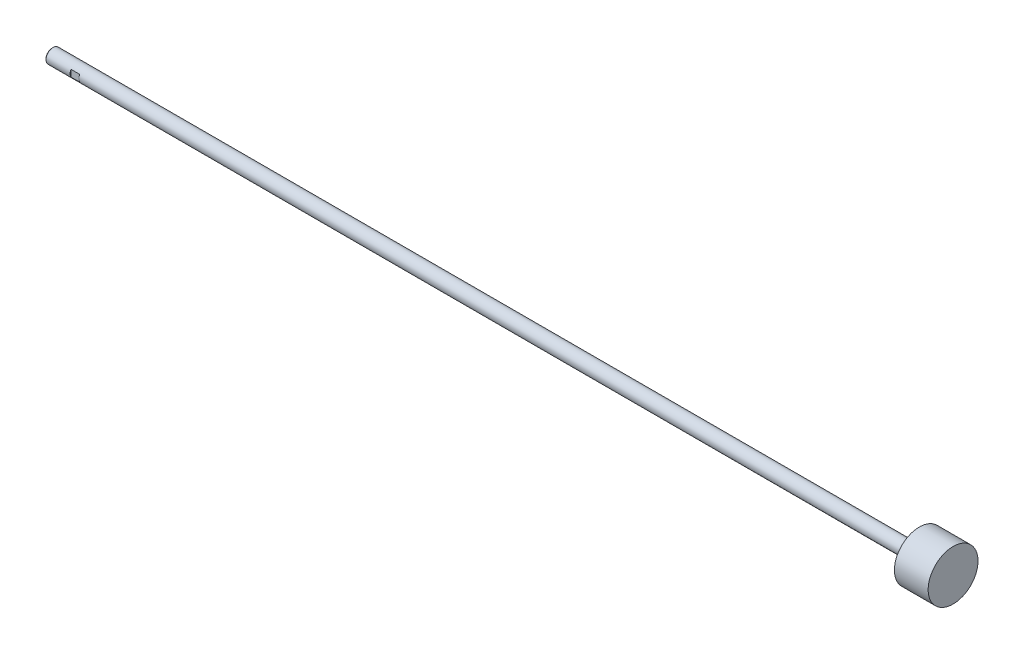
ISO-10303-21;
HEADER;
FILE_DESCRIPTION(('STEP AP214'),'2;1');
FILE_NAME('part.step','',(''),(''),'','','');
FILE_SCHEMA(('AUTOMOTIVE_DESIGN { 1 0 10303 214 1 1 1 1 }'));
ENDSEC;
DATA;
#1=APPLICATION_CONTEXT('core data for automotive mechanical design processes');
#2=APPLICATION_PROTOCOL_DEFINITION('international standard','automotive_design',2000,#1);
#3=PRODUCT_CONTEXT('',#1,'mechanical');
#4=PRODUCT('Part','Part','',(#3));
#5=PRODUCT_RELATED_PRODUCT_CATEGORY('part','',(#4));
#6=PRODUCT_DEFINITION_FORMATION('','',#4);
#7=PRODUCT_DEFINITION_CONTEXT('part definition',#1,'design');
#8=PRODUCT_DEFINITION('design','',#6,#7);
#9=PRODUCT_DEFINITION_SHAPE('','',#8);
#10=(LENGTH_UNIT() NAMED_UNIT(*) SI_UNIT(.MILLI.,.METRE.));
#11=(NAMED_UNIT(*) PLANE_ANGLE_UNIT() SI_UNIT($,.RADIAN.));
#12=(NAMED_UNIT(*) SI_UNIT($,.STERADIAN.) SOLID_ANGLE_UNIT());
#13=UNCERTAINTY_MEASURE_WITH_UNIT(LENGTH_MEASURE(1.E-05),#10,'distance_accuracy_value','');
#14=(GEOMETRIC_REPRESENTATION_CONTEXT(3) GLOBAL_UNCERTAINTY_ASSIGNED_CONTEXT((#13)) GLOBAL_UNIT_ASSIGNED_CONTEXT((#10,
#11,#12)) REPRESENTATION_CONTEXT('',''));
#15=CARTESIAN_POINT('',(0.,0.,0.));
#16=DIRECTION('',(0.,0.,1.));
#17=DIRECTION('',(1.,0.,0.));
#18=AXIS2_PLACEMENT_3D('',#15,#16,#17);
#19=CARTESIAN_POINT('',(403.2885,22.34565,0.));
#20=DIRECTION('',(-1.,0.,0.));
#21=DIRECTION('',(0.,0.,1.));
#22=AXIS2_PLACEMENT_3D('',#19,#20,#21);
#23=PLANE('',#22);
#24=CARTESIAN_POINT('',(403.2885,0.,0.));
#25=DIRECTION('',(-1.,0.,0.));
#26=DIRECTION('',(0.,0.,1.));
#27=AXIS2_PLACEMENT_3D('',#24,#25,#26);
#28=CIRCLE('',#27,22.34565);
#29=CARTESIAN_POINT('',(403.2885,0.,22.34565));
#30=VERTEX_POINT('',#29);
#31=EDGE_CURVE('E19',#30,#30,#28,.T.);
#32=ORIENTED_EDGE('',*,*,#31,.F.);
#33=EDGE_LOOP('',(#32));
#34=FACE_BOUND('',#33,.T.);
#35=ADVANCED_FACE('F16',(#34),#23,.F.);
#36=CARTESIAN_POINT('',(403.2885,0.,0.));
#37=DIRECTION('',(-1.,0.,0.));
#38=DIRECTION('',(0.,0.,1.));
#39=AXIS2_PLACEMENT_3D('',#36,#37,#38);
#40=CYLINDRICAL_SURFACE('',#39,22.34565);
#41=CARTESIAN_POINT('',(373.0625,0.,0.));
#42=DIRECTION('',(-1.,0.,0.));
#43=DIRECTION('',(0.,0.,1.));
#44=AXIS2_PLACEMENT_3D('',#41,#42,#43);
#45=CIRCLE('',#44,22.34565);
#46=CARTESIAN_POINT('',(373.0625,0.,22.34565));
#47=VERTEX_POINT('',#46);
#48=EDGE_CURVE('E93',#47,#47,#45,.F.);
#49=ORIENTED_EDGE('',*,*,#48,.T.);
#50=EDGE_LOOP('',(#49));
#51=FACE_BOUND('',#50,.T.);
#52=ORIENTED_EDGE('',*,*,#31,.T.);
#53=EDGE_LOOP('',(#52));
#54=FACE_BOUND('',#53,.T.);
#55=ADVANCED_FACE('F100',(#51,#54),#40,.T.);
#56=CARTESIAN_POINT('',(-403.2885,0.,0.));
#57=DIRECTION('',(1.,0.,0.));
#58=DIRECTION('',(0.,0.,-1.));
#59=AXIS2_PLACEMENT_3D('',#56,#57,#58);
#60=PLANE('',#59);
#61=CARTESIAN_POINT('',(-403.288500000031,0.,0.));
#62=DIRECTION('',(1.,0.,0.));
#63=DIRECTION('',(0.,0.,-1.));
#64=AXIS2_PLACEMENT_3D('',#61,#62,#63);
#65=CIRCLE('',#64,5.59435000008079);
#66=CARTESIAN_POINT('',(-403.288500000031,0.,-5.59435000008079));
#67=VERTEX_POINT('',#66);
#68=EDGE_CURVE('E74',#67,#67,#65,.T.);
#69=ORIENTED_EDGE('',*,*,#68,.F.);
#70=EDGE_LOOP('',(#69));
#71=FACE_BOUND('',#70,.T.);
#72=ADVANCED_FACE('F107',(#71),#60,.F.);
#73=CARTESIAN_POINT('',(373.0625,6.35,0.));
#74=DIRECTION('',(1.,0.,0.));
#75=DIRECTION('',(0.,0.,-1.));
#76=AXIS2_PLACEMENT_3D('',#73,#74,#75);
#77=PLANE('',#76);
#78=CARTESIAN_POINT('',(373.0625,0.,0.));
#79=DIRECTION('',(-1.,0.,0.));
#80=DIRECTION('',(0.,0.,1.));
#81=AXIS2_PLACEMENT_3D('',#78,#79,#80);
#82=CIRCLE('',#81,6.35);
#83=CARTESIAN_POINT('',(373.0625,0.,6.35));
#84=VERTEX_POINT('',#83);
#85=EDGE_CURVE('E91',#84,#84,#82,.T.);
#86=ORIENTED_EDGE('',*,*,#85,.F.);
#87=EDGE_LOOP('',(#86));
#88=FACE_BOUND('',#87,.T.);
#89=ORIENTED_EDGE('',*,*,#48,.F.);
#90=EDGE_LOOP('',(#89));
#91=FACE_BOUND('',#90,.T.);
#92=ADVANCED_FACE('F136',(#88,#91),#77,.F.);
#93=CARTESIAN_POINT('',(-373.0625,0.,0.));
#94=DIRECTION('',(1.,0.,0.));
#95=DIRECTION('',(0.,0.,-1.));
#96=AXIS2_PLACEMENT_3D('',#93,#94,#95);
#97=PLANE('',#96);
#98=CARTESIAN_POINT('',(-373.0625,0.,0.));
#99=DIRECTION('',(-1.,0.,0.));
#100=DIRECTION('',(0.,0.,1.));
#101=AXIS2_PLACEMENT_3D('',#98,#99,#100);
#102=CIRCLE('',#101,6.35);
#103=CARTESIAN_POINT('',(-373.0625,3.01608289010763,5.588));
#104=VERTEX_POINT('',#103);
#105=CARTESIAN_POINT('',(-373.0625,-3.01608289010763,5.588));
#106=VERTEX_POINT('',#105);
#107=EDGE_CURVE('E53',#104,#106,#102,.F.);
#108=ORIENTED_EDGE('',*,*,#107,.F.);
#109=DIRECTION('',(0.,1.,0.));
#110=VECTOR('',#109,1.);
#111=CARTESIAN_POINT('',(-373.0625,6.35,5.588));
#112=LINE('',#111,#110);
#113=EDGE_CURVE('E75',#104,#106,#112,.F.);
#114=ORIENTED_EDGE('',*,*,#113,.T.);
#115=EDGE_LOOP('',(#108,#114));
#116=FACE_BOUND('',#115,.T.);
#117=ADVANCED_FACE('F133',(#116),#97,.F.);
#118=CARTESIAN_POINT('',(-373.0625,6.35,5.588));
#119=DIRECTION('',(0.,0.,-1.));
#120=DIRECTION('',(-1.,0.,0.));
#121=AXIS2_PLACEMENT_3D('',#118,#119,#120);
#122=PLANE('',#121);
#123=DIRECTION('',(-1.,0.,0.));
#124=VECTOR('',#123,1.);
#125=CARTESIAN_POINT('',(403.2885,-3.01608289010763,5.588));
#126=LINE('',#125,#124);
#127=CARTESIAN_POINT('',(-380.9365,-3.01608289010763,5.588));
#128=VERTEX_POINT('',#127);
#129=EDGE_CURVE('E67',#106,#128,#126,.T.);
#130=ORIENTED_EDGE('',*,*,#129,.F.);
#131=ORIENTED_EDGE('',*,*,#113,.F.);
#132=DIRECTION('',(-1.,0.,0.));
#133=VECTOR('',#132,1.);
#134=CARTESIAN_POINT('',(403.2885,3.01608289010763,5.588));
#135=LINE('',#134,#133);
#136=CARTESIAN_POINT('',(-380.9365,3.01608289010763,5.588));
#137=VERTEX_POINT('',#136);
#138=EDGE_CURVE('E65',#137,#104,#135,.F.);
#139=ORIENTED_EDGE('',*,*,#138,.F.);
#140=DIRECTION('',(0.,1.,0.));
#141=VECTOR('',#140,1.);
#142=CARTESIAN_POINT('',(-380.9365,0.,5.588));
#143=LINE('',#142,#141);
#144=EDGE_CURVE('E71',#128,#137,#143,.T.);
#145=ORIENTED_EDGE('',*,*,#144,.F.);
#146=EDGE_LOOP('',(#130,#131,#139,#145));
#147=FACE_BOUND('',#146,.T.);
#148=ADVANCED_FACE('F77',(#147),#122,.F.);
#149=CARTESIAN_POINT('',(-380.9365,0.,0.));
#150=DIRECTION('',(1.,0.,0.));
#151=DIRECTION('',(0.,0.,-1.));
#152=AXIS2_PLACEMENT_3D('',#149,#150,#151);
#153=PLANE('',#152);
#154=CARTESIAN_POINT('',(-380.9365,0.,0.));
#155=DIRECTION('',(-1.,0.,0.));
#156=DIRECTION('',(0.,0.,1.));
#157=AXIS2_PLACEMENT_3D('',#154,#155,#156);
#158=CIRCLE('',#157,6.35);
#159=EDGE_CURVE('E60',#128,#137,#158,.T.);
#160=ORIENTED_EDGE('',*,*,#159,.F.);
#161=ORIENTED_EDGE('',*,*,#144,.T.);
#162=EDGE_LOOP('',(#160,#161));
#163=FACE_BOUND('',#162,.T.);
#164=ADVANCED_FACE('F72',(#163),#153,.T.);
#165=CARTESIAN_POINT('',(-402.532850000057,0.,0.));
#166=DIRECTION('',(1.,0.,0.));
#167=DIRECTION('',(0.,0.,-1.));
#168=AXIS2_PLACEMENT_3D('',#165,#166,#167);
#169=CONICAL_SURFACE('',#168,6.35000000005448,0.785398163397448);
#170=CARTESIAN_POINT('',(-402.53285,0.,0.));
#171=DIRECTION('',(-1.,0.,0.));
#172=DIRECTION('',(0.,0.,1.));
#173=AXIS2_PLACEMENT_3D('',#170,#171,#172);
#174=CIRCLE('',#173,6.35);
#175=CARTESIAN_POINT('',(-402.53285,0.,6.35));
#176=VERTEX_POINT('',#175);
#177=EDGE_CURVE('E69',#176,#176,#174,.F.);
#178=ORIENTED_EDGE('',*,*,#177,.F.);
#179=EDGE_LOOP('',(#178));
#180=FACE_BOUND('',#179,.T.);
#181=ORIENTED_EDGE('',*,*,#68,.T.);
#182=EDGE_LOOP('',(#181));
#183=FACE_BOUND('',#182,.T.);
#184=ADVANCED_FACE('F124',(#180,#183),#169,.T.);
#185=CARTESIAN_POINT('',(-380.9365,0.,0.));
#186=DIRECTION('',(1.,0.,0.));
#187=DIRECTION('',(0.,0.,-1.));
#188=AXIS2_PLACEMENT_3D('',#185,#186,#187);
#189=PLANE('',#188);
#190=CARTESIAN_POINT('',(-380.9365,0.,0.));
#191=DIRECTION('',(-1.,0.,0.));
#192=DIRECTION('',(0.,0.,1.));
#193=AXIS2_PLACEMENT_3D('',#190,#191,#192);
#194=CIRCLE('',#193,6.35);
#195=CARTESIAN_POINT('',(-380.9365,3.01608289010763,-5.588));
#196=VERTEX_POINT('',#195);
#197=CARTESIAN_POINT('',(-380.9365,-3.01608289010763,-5.588));
#198=VERTEX_POINT('',#197);
#199=EDGE_CURVE('E87',#196,#198,#194,.T.);
#200=ORIENTED_EDGE('',*,*,#199,.F.);
#201=DIRECTION('',(0.,1.,0.));
#202=VECTOR('',#201,1.);
#203=CARTESIAN_POINT('',(-380.9365,-6.35,-5.588));
#204=LINE('',#203,#202);
#205=EDGE_CURVE('E81',#196,#198,#204,.F.);
#206=ORIENTED_EDGE('',*,*,#205,.T.);
#207=EDGE_LOOP('',(#200,#206));
#208=FACE_BOUND('',#207,.T.);
#209=ADVANCED_FACE('F121',(#208),#189,.T.);
#210=CARTESIAN_POINT('',(-373.0625,-6.35,-5.588));
#211=DIRECTION('',(0.,0.,1.));
#212=DIRECTION('',(1.,0.,0.));
#213=AXIS2_PLACEMENT_3D('',#210,#211,#212);
#214=PLANE('',#213);
#215=DIRECTION('',(1.,0.,0.));
#216=VECTOR('',#215,1.);
#217=CARTESIAN_POINT('',(-373.0625,3.01608289010763,-5.588));
#218=LINE('',#217,#216);
#219=CARTESIAN_POINT('',(-373.0625,3.01608289010763,-5.588));
#220=VERTEX_POINT('',#219);
#221=EDGE_CURVE('E78',#220,#196,#218,.F.);
#222=ORIENTED_EDGE('',*,*,#221,.F.);
#223=DIRECTION('',(0.,1.,0.));
#224=VECTOR('',#223,1.);
#225=CARTESIAN_POINT('',(-373.0625,0.,-5.588));
#226=LINE('',#225,#224);
#227=CARTESIAN_POINT('',(-373.0625,-3.01608289010763,-5.588));
#228=VERTEX_POINT('',#227);
#229=EDGE_CURVE('E34',#220,#228,#226,.F.);
#230=ORIENTED_EDGE('',*,*,#229,.T.);
#231=DIRECTION('',(-1.,0.,0.));
#232=VECTOR('',#231,1.);
#233=CARTESIAN_POINT('',(403.2885,-3.01608289010763,-5.588));
#234=LINE('',#233,#232);
#235=EDGE_CURVE('E25',#198,#228,#234,.F.);
#236=ORIENTED_EDGE('',*,*,#235,.F.);
#237=ORIENTED_EDGE('',*,*,#205,.F.);
#238=EDGE_LOOP('',(#222,#230,#236,#237));
#239=FACE_BOUND('',#238,.T.);
#240=ADVANCED_FACE('F115',(#239),#214,.F.);
#241=CARTESIAN_POINT('',(-373.0625,0.,0.));
#242=DIRECTION('',(1.,0.,0.));
#243=DIRECTION('',(0.,0.,-1.));
#244=AXIS2_PLACEMENT_3D('',#241,#242,#243);
#245=PLANE('',#244);
#246=ORIENTED_EDGE('',*,*,#229,.F.);
#247=CARTESIAN_POINT('',(-373.0625,0.,0.));
#248=DIRECTION('',(-1.,0.,0.));
#249=DIRECTION('',(0.,0.,1.));
#250=AXIS2_PLACEMENT_3D('',#247,#248,#249);
#251=CIRCLE('',#250,6.35);
#252=EDGE_CURVE('E10',#228,#220,#251,.F.);
#253=ORIENTED_EDGE('',*,*,#252,.F.);
#254=EDGE_LOOP('',(#246,#253));
#255=FACE_BOUND('',#254,.T.);
#256=ADVANCED_FACE('F109',(#255),#245,.F.);
#257=CARTESIAN_POINT('',(403.2885,0.,0.));
#258=DIRECTION('',(-1.,0.,0.));
#259=DIRECTION('',(0.,0.,1.));
#260=AXIS2_PLACEMENT_3D('',#257,#258,#259);
#261=CYLINDRICAL_SURFACE('',#260,6.35);
#262=ORIENTED_EDGE('',*,*,#85,.T.);
#263=EDGE_LOOP('',(#262));
#264=FACE_BOUND('',#263,.T.);
#265=ORIENTED_EDGE('',*,*,#138,.T.);
#266=ORIENTED_EDGE('',*,*,#107,.T.);
#267=ORIENTED_EDGE('',*,*,#129,.T.);
#268=ORIENTED_EDGE('',*,*,#159,.T.);
#269=EDGE_LOOP('',(#265,#266,#267,#268));
#270=FACE_BOUND('',#269,.T.);
#271=ORIENTED_EDGE('',*,*,#177,.T.);
#272=EDGE_LOOP('',(#271));
#273=FACE_BOUND('',#272,.T.);
#274=ORIENTED_EDGE('',*,*,#235,.T.);
#275=ORIENTED_EDGE('',*,*,#252,.T.);
#276=ORIENTED_EDGE('',*,*,#221,.T.);
#277=ORIENTED_EDGE('',*,*,#199,.T.);
#278=EDGE_LOOP('',(#274,#275,#276,#277));
#279=FACE_BOUND('',#278,.T.);
#280=ADVANCED_FACE('F62',(#264,#270,#273,#279),#261,.T.);
#281=CLOSED_SHELL('',(#35,#55,#72,#92,#117,#148,#164,#184,#209,#240,#256,#280));
#282=MANIFOLD_SOLID_BREP('B1',#281);
#283=ADVANCED_BREP_SHAPE_REPRESENTATION('',(#18,#282),#14);
#284=SHAPE_DEFINITION_REPRESENTATION(#9,#283);
ENDSEC;
END-ISO-10303-21;
